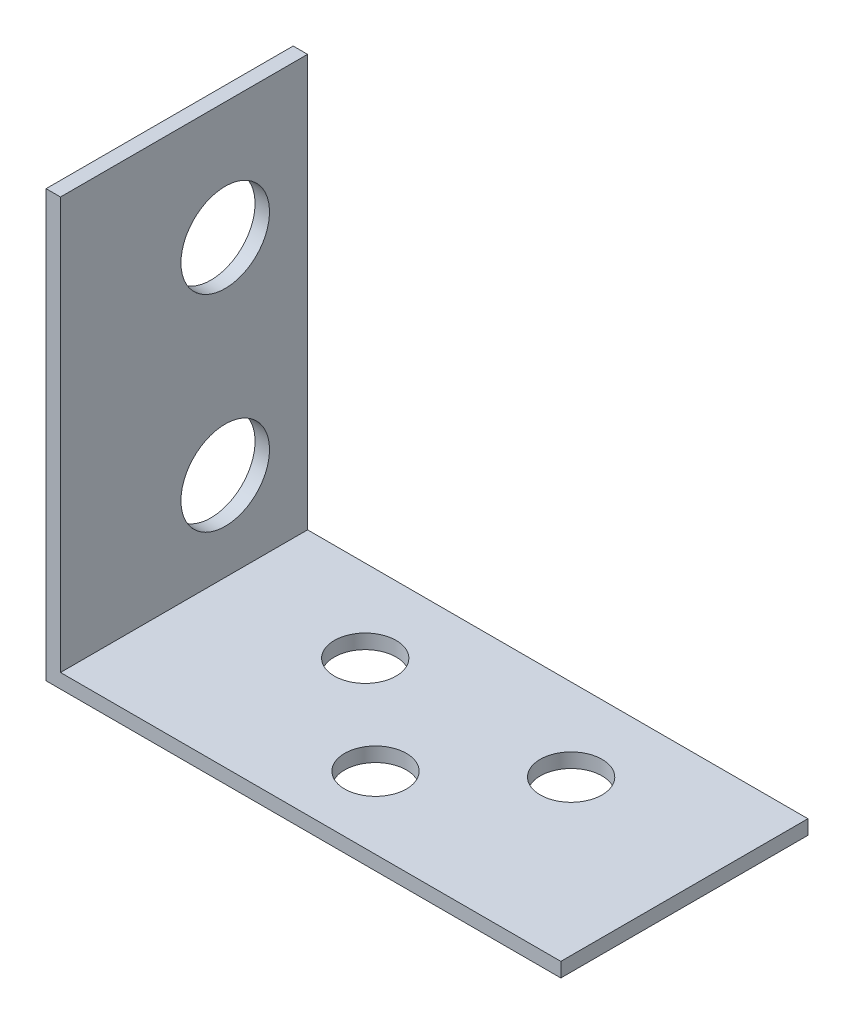
ISO-10303-21;
HEADER;
FILE_DESCRIPTION(('STEP AP214'),'2;1');
FILE_NAME('part.step','',(''),(''),'','','');
FILE_SCHEMA(('AUTOMOTIVE_DESIGN { 1 0 10303 214 1 1 1 1 }'));
ENDSEC;
DATA;
#1=APPLICATION_CONTEXT('core data for automotive mechanical design processes');
#2=APPLICATION_PROTOCOL_DEFINITION('international standard','automotive_design',2000,#1);
#3=PRODUCT_CONTEXT('',#1,'mechanical');
#4=PRODUCT('Part','Part','',(#3));
#5=PRODUCT_RELATED_PRODUCT_CATEGORY('part','',(#4));
#6=PRODUCT_DEFINITION_FORMATION('','',#4);
#7=PRODUCT_DEFINITION_CONTEXT('part definition',#1,'design');
#8=PRODUCT_DEFINITION('design','',#6,#7);
#9=PRODUCT_DEFINITION_SHAPE('','',#8);
#10=(LENGTH_UNIT() NAMED_UNIT(*) SI_UNIT(.MILLI.,.METRE.));
#11=(NAMED_UNIT(*) PLANE_ANGLE_UNIT() SI_UNIT($,.RADIAN.));
#12=(NAMED_UNIT(*) SI_UNIT($,.STERADIAN.) SOLID_ANGLE_UNIT());
#13=UNCERTAINTY_MEASURE_WITH_UNIT(LENGTH_MEASURE(1.E-05),#10,'distance_accuracy_value','');
#14=(GEOMETRIC_REPRESENTATION_CONTEXT(3) GLOBAL_UNCERTAINTY_ASSIGNED_CONTEXT((#13)) GLOBAL_UNIT_ASSIGNED_CONTEXT((#10,
#11,#12)) REPRESENTATION_CONTEXT('',''));
#15=CARTESIAN_POINT('',(0.,0.,0.));
#16=DIRECTION('',(0.,0.,1.));
#17=DIRECTION('',(1.,0.,0.));
#18=AXIS2_PLACEMENT_3D('',#15,#16,#17);
#19=CARTESIAN_POINT('',(12.5,0.7,0.));
#20=DIRECTION('',(1.,0.,0.));
#21=DIRECTION('',(0.,0.,-1.));
#22=AXIS2_PLACEMENT_3D('',#19,#20,#21);
#23=PLANE('',#22);
#24=DIRECTION('',(0.,0.,1.));
#25=VECTOR('',#24,1.);
#26=CARTESIAN_POINT('',(12.5,0.,0.));
#27=LINE('',#26,#25);
#28=CARTESIAN_POINT('',(12.5,0.,-12.));
#29=VERTEX_POINT('',#28);
#30=CARTESIAN_POINT('',(12.5,0.,0.));
#31=VERTEX_POINT('',#30);
#32=EDGE_CURVE('E87',#29,#31,#27,.T.);
#33=ORIENTED_EDGE('',*,*,#32,.F.);
#34=DIRECTION('',(0.,-1.,0.));
#35=VECTOR('',#34,1.);
#36=CARTESIAN_POINT('',(12.5,0.7,-12.));
#37=LINE('',#36,#35);
#38=CARTESIAN_POINT('',(12.5,0.7,-12.));
#39=VERTEX_POINT('',#38);
#40=EDGE_CURVE('E11',#39,#29,#37,.T.);
#41=ORIENTED_EDGE('',*,*,#40,.F.);
#42=DIRECTION('',(0.,0.,1.));
#43=VECTOR('',#42,1.);
#44=CARTESIAN_POINT('',(12.5,0.7,0.));
#45=LINE('',#44,#43);
#46=CARTESIAN_POINT('',(12.5,0.7,0.));
#47=VERTEX_POINT('',#46);
#48=EDGE_CURVE('E89',#39,#47,#45,.T.);
#49=ORIENTED_EDGE('',*,*,#48,.T.);
#50=DIRECTION('',(0.,-1.,0.));
#51=VECTOR('',#50,1.);
#52=CARTESIAN_POINT('',(12.5,0.7,0.));
#53=LINE('',#52,#51);
#54=EDGE_CURVE('E83',#47,#31,#53,.T.);
#55=ORIENTED_EDGE('',*,*,#54,.T.);
#56=EDGE_LOOP('',(#33,#41,#49,#55));
#57=FACE_BOUND('',#56,.T.);
#58=ADVANCED_FACE('F41',(#57),#23,.T.);
#59=CARTESIAN_POINT('',(0.,0.7,-12.));
#60=DIRECTION('',(0.,0.,-1.));
#61=DIRECTION('',(-1.,0.,0.));
#62=AXIS2_PLACEMENT_3D('',#59,#60,#61);
#63=PLANE('',#62);
#64=DIRECTION('',(1.,0.,0.));
#65=VECTOR('',#64,1.);
#66=CARTESIAN_POINT('',(0.,0.,-12.));
#67=LINE('',#66,#65);
#68=CARTESIAN_POINT('',(-12.5,0.,-12.));
#69=VERTEX_POINT('',#68);
#70=EDGE_CURVE('E110',#69,#29,#67,.T.);
#71=ORIENTED_EDGE('',*,*,#70,.F.);
#72=DIRECTION('',(0.,-1.,0.));
#73=VECTOR('',#72,1.);
#74=CARTESIAN_POINT('',(-12.5,0.7,-12.));
#75=LINE('',#74,#73);
#76=CARTESIAN_POINT('',(-12.5,20.7,-12.));
#77=VERTEX_POINT('',#76);
#78=EDGE_CURVE('E51',#77,#69,#75,.T.);
#79=ORIENTED_EDGE('',*,*,#78,.F.);
#80=DIRECTION('',(-1.,0.,0.));
#81=VECTOR('',#80,1.);
#82=CARTESIAN_POINT('',(-12.5,20.7,-12.));
#83=LINE('',#82,#81);
#84=CARTESIAN_POINT('',(-11.8,20.7,-12.));
#85=VERTEX_POINT('',#84);
#86=EDGE_CURVE('E165',#85,#77,#83,.T.);
#87=ORIENTED_EDGE('',*,*,#86,.F.);
#88=DIRECTION('',(0.,-1.,0.));
#89=VECTOR('',#88,1.);
#90=CARTESIAN_POINT('',(-11.8,20.7,-12.));
#91=LINE('',#90,#89);
#92=CARTESIAN_POINT('',(-11.8,0.7,-12.));
#93=VERTEX_POINT('',#92);
#94=EDGE_CURVE('E169',#85,#93,#91,.T.);
#95=ORIENTED_EDGE('',*,*,#94,.T.);
#96=DIRECTION('',(1.,0.,0.));
#97=VECTOR('',#96,1.);
#98=CARTESIAN_POINT('',(0.,0.7,-12.));
#99=LINE('',#98,#97);
#100=EDGE_CURVE('E183',#93,#39,#99,.T.);
#101=ORIENTED_EDGE('',*,*,#100,.T.);
#102=ORIENTED_EDGE('',*,*,#40,.T.);
#103=EDGE_LOOP('',(#71,#79,#87,#95,#101,#102));
#104=FACE_BOUND('',#103,.T.);
#105=ADVANCED_FACE('F216',(#104),#63,.T.);
#106=CARTESIAN_POINT('',(-12.5,0.7,0.));
#107=DIRECTION('',(1.,0.,0.));
#108=DIRECTION('',(0.,0.,-1.));
#109=AXIS2_PLACEMENT_3D('',#106,#107,#108);
#110=PLANE('',#109);
#111=CARTESIAN_POINT('',(-12.5,5.,-8.));
#112=DIRECTION('',(-1.,0.,0.));
#113=DIRECTION('',(0.,0.,1.));
#114=AXIS2_PLACEMENT_3D('',#111,#112,#113);
#115=CIRCLE('',#114,2.15);
#116=CARTESIAN_POINT('',(-12.5,5.,-5.85));
#117=VERTEX_POINT('',#116);
#118=EDGE_CURVE('E138',#117,#117,#115,.T.);
#119=ORIENTED_EDGE('',*,*,#118,.F.);
#120=EDGE_LOOP('',(#119));
#121=FACE_BOUND('',#120,.T.);
#122=CARTESIAN_POINT('',(-12.5,15.,-8.));
#123=DIRECTION('',(-1.,0.,0.));
#124=DIRECTION('',(0.,0.,1.));
#125=AXIS2_PLACEMENT_3D('',#122,#123,#124);
#126=CIRCLE('',#125,2.15);
#127=CARTESIAN_POINT('',(-12.5,15.,-5.85));
#128=VERTEX_POINT('',#127);
#129=EDGE_CURVE('E145',#128,#128,#126,.T.);
#130=ORIENTED_EDGE('',*,*,#129,.F.);
#131=EDGE_LOOP('',(#130));
#132=FACE_BOUND('',#131,.T.);
#133=DIRECTION('',(0.,0.,1.));
#134=VECTOR('',#133,1.);
#135=CARTESIAN_POINT('',(-12.5,0.,0.));
#136=LINE('',#135,#134);
#137=CARTESIAN_POINT('',(-12.5,0.,0.));
#138=VERTEX_POINT('',#137);
#139=EDGE_CURVE('E105',#69,#138,#136,.T.);
#140=ORIENTED_EDGE('',*,*,#139,.T.);
#141=DIRECTION('',(0.,-1.,0.));
#142=VECTOR('',#141,1.);
#143=CARTESIAN_POINT('',(-12.5,0.7,0.));
#144=LINE('',#143,#142);
#145=CARTESIAN_POINT('',(-12.5,20.7,0.));
#146=VERTEX_POINT('',#145);
#147=EDGE_CURVE('E92',#146,#138,#144,.T.);
#148=ORIENTED_EDGE('',*,*,#147,.F.);
#149=DIRECTION('',(0.,0.,1.));
#150=VECTOR('',#149,1.);
#151=CARTESIAN_POINT('',(-12.5,20.7,0.));
#152=LINE('',#151,#150);
#153=EDGE_CURVE('E153',#77,#146,#152,.T.);
#154=ORIENTED_EDGE('',*,*,#153,.F.);
#155=ORIENTED_EDGE('',*,*,#78,.T.);
#156=EDGE_LOOP('',(#140,#148,#154,#155));
#157=FACE_BOUND('',#156,.T.);
#158=ADVANCED_FACE('F220',(#121,#132,#157),#110,.F.);
#159=CARTESIAN_POINT('',(-5.00000000000001,0.7,-8.));
#160=DIRECTION('',(0.,-1.,0.));
#161=DIRECTION('',(0.,0.,-1.));
#162=AXIS2_PLACEMENT_3D('',#159,#160,#161);
#163=CYLINDRICAL_SURFACE('',#162,1.5);
#164=CARTESIAN_POINT('',(-5.00000000000001,0.7,-8.));
#165=DIRECTION('',(0.,1.,0.));
#166=DIRECTION('',(0.,0.,1.));
#167=AXIS2_PLACEMENT_3D('',#164,#165,#166);
#168=CIRCLE('',#167,1.5);
#169=CARTESIAN_POINT('',(-5.00000000000001,0.7,-6.5));
#170=VERTEX_POINT('',#169);
#171=EDGE_CURVE('E188',#170,#170,#168,.T.);
#172=ORIENTED_EDGE('',*,*,#171,.T.);
#173=EDGE_LOOP('',(#172));
#174=FACE_BOUND('',#173,.T.);
#175=CARTESIAN_POINT('',(-5.00000000000001,0.,-8.));
#176=DIRECTION('',(0.,1.,0.));
#177=DIRECTION('',(0.,0.,1.));
#178=AXIS2_PLACEMENT_3D('',#175,#176,#177);
#179=CIRCLE('',#178,1.5);
#180=CARTESIAN_POINT('',(-5.00000000000001,0.,-6.5));
#181=VERTEX_POINT('',#180);
#182=EDGE_CURVE('E104',#181,#181,#179,.T.);
#183=ORIENTED_EDGE('',*,*,#182,.F.);
#184=EDGE_LOOP('',(#183));
#185=FACE_BOUND('',#184,.T.);
#186=ADVANCED_FACE('F226',(#174,#185),#163,.F.);
#187=CARTESIAN_POINT('',(0.,0.7,0.));
#188=DIRECTION('',(0.,0.,-1.));
#189=DIRECTION('',(-1.,0.,0.));
#190=AXIS2_PLACEMENT_3D('',#187,#188,#189);
#191=PLANE('',#190);
#192=DIRECTION('',(1.,0.,0.));
#193=VECTOR('',#192,1.);
#194=CARTESIAN_POINT('',(0.,0.,0.));
#195=LINE('',#194,#193);
#196=EDGE_CURVE('E96',#138,#31,#195,.T.);
#197=ORIENTED_EDGE('',*,*,#196,.T.);
#198=ORIENTED_EDGE('',*,*,#54,.F.);
#199=DIRECTION('',(1.,0.,0.));
#200=VECTOR('',#199,1.);
#201=CARTESIAN_POINT('',(0.,0.7,0.));
#202=LINE('',#201,#200);
#203=CARTESIAN_POINT('',(-11.8,0.7,0.));
#204=VERTEX_POINT('',#203);
#205=EDGE_CURVE('E64',#204,#47,#202,.T.);
#206=ORIENTED_EDGE('',*,*,#205,.F.);
#207=DIRECTION('',(0.,-1.,0.));
#208=VECTOR('',#207,1.);
#209=CARTESIAN_POINT('',(-11.8,20.7,0.));
#210=LINE('',#209,#208);
#211=CARTESIAN_POINT('',(-11.8,20.7,0.));
#212=VERTEX_POINT('',#211);
#213=EDGE_CURVE('E118',#212,#204,#210,.T.);
#214=ORIENTED_EDGE('',*,*,#213,.F.);
#215=DIRECTION('',(1.,0.,0.));
#216=VECTOR('',#215,1.);
#217=CARTESIAN_POINT('',(-12.5,20.7,0.));
#218=LINE('',#217,#216);
#219=EDGE_CURVE('E157',#146,#212,#218,.T.);
#220=ORIENTED_EDGE('',*,*,#219,.F.);
#221=ORIENTED_EDGE('',*,*,#147,.T.);
#222=EDGE_LOOP('',(#197,#198,#206,#214,#220,#221));
#223=FACE_BOUND('',#222,.T.);
#224=ADVANCED_FACE('F97',(#223),#191,.F.);
#225=CARTESIAN_POINT('',(0.,0.7,-3.5));
#226=DIRECTION('',(0.,-1.,0.));
#227=DIRECTION('',(0.,0.,-1.));
#228=AXIS2_PLACEMENT_3D('',#225,#226,#227);
#229=CYLINDRICAL_SURFACE('',#228,1.5);
#230=CARTESIAN_POINT('',(0.,0.7,-3.5));
#231=DIRECTION('',(0.,1.,0.));
#232=DIRECTION('',(0.,0.,1.));
#233=AXIS2_PLACEMENT_3D('',#230,#231,#232);
#234=CIRCLE('',#233,1.5);
#235=CARTESIAN_POINT('',(0.,0.7,-2.));
#236=VERTEX_POINT('',#235);
#237=EDGE_CURVE('E130',#236,#236,#234,.T.);
#238=ORIENTED_EDGE('',*,*,#237,.T.);
#239=EDGE_LOOP('',(#238));
#240=FACE_BOUND('',#239,.T.);
#241=CARTESIAN_POINT('',(0.,0.,-3.5));
#242=DIRECTION('',(0.,1.,0.));
#243=DIRECTION('',(0.,0.,1.));
#244=AXIS2_PLACEMENT_3D('',#241,#242,#243);
#245=CIRCLE('',#244,1.5);
#246=CARTESIAN_POINT('',(0.,0.,-2.));
#247=VERTEX_POINT('',#246);
#248=EDGE_CURVE('E112',#247,#247,#245,.T.);
#249=ORIENTED_EDGE('',*,*,#248,.F.);
#250=EDGE_LOOP('',(#249));
#251=FACE_BOUND('',#250,.T.);
#252=ADVANCED_FACE('F43',(#240,#251),#229,.F.);
#253=CARTESIAN_POINT('',(5.00000000000001,0.7,-8.));
#254=DIRECTION('',(0.,-1.,0.));
#255=DIRECTION('',(0.,0.,-1.));
#256=AXIS2_PLACEMENT_3D('',#253,#254,#255);
#257=CYLINDRICAL_SURFACE('',#256,1.5);
#258=CARTESIAN_POINT('',(5.00000000000001,0.7,-8.));
#259=DIRECTION('',(0.,1.,0.));
#260=DIRECTION('',(0.,0.,1.));
#261=AXIS2_PLACEMENT_3D('',#258,#259,#260);
#262=CIRCLE('',#261,1.5);
#263=CARTESIAN_POINT('',(5.00000000000001,0.7,-6.5));
#264=VERTEX_POINT('',#263);
#265=EDGE_CURVE('E93',#264,#264,#262,.F.);
#266=ORIENTED_EDGE('',*,*,#265,.F.);
#267=EDGE_LOOP('',(#266));
#268=FACE_BOUND('',#267,.T.);
#269=CARTESIAN_POINT('',(5.00000000000001,0.,-8.));
#270=DIRECTION('',(0.,1.,0.));
#271=DIRECTION('',(0.,0.,1.));
#272=AXIS2_PLACEMENT_3D('',#269,#270,#271);
#273=CIRCLE('',#272,1.5);
#274=CARTESIAN_POINT('',(5.00000000000001,0.,-6.5));
#275=VERTEX_POINT('',#274);
#276=EDGE_CURVE('E127',#275,#275,#273,.F.);
#277=ORIENTED_EDGE('',*,*,#276,.T.);
#278=EDGE_LOOP('',(#277));
#279=FACE_BOUND('',#278,.T.);
#280=ADVANCED_FACE('F197',(#268,#279),#257,.F.);
#281=CARTESIAN_POINT('',(0.,0.7,0.));
#282=DIRECTION('',(0.,1.,0.));
#283=DIRECTION('',(0.,0.,1.));
#284=AXIS2_PLACEMENT_3D('',#281,#282,#283);
#285=PLANE('',#284);
#286=DIRECTION('',(0.,0.,-1.));
#287=VECTOR('',#286,1.);
#288=CARTESIAN_POINT('',(-11.8,0.7,0.));
#289=LINE('',#288,#287);
#290=EDGE_CURVE('E59',#204,#93,#289,.T.);
#291=ORIENTED_EDGE('',*,*,#290,.F.);
#292=ORIENTED_EDGE('',*,*,#205,.T.);
#293=ORIENTED_EDGE('',*,*,#48,.F.);
#294=ORIENTED_EDGE('',*,*,#100,.F.);
#295=EDGE_LOOP('',(#291,#292,#293,#294));
#296=FACE_BOUND('',#295,.T.);
#297=ORIENTED_EDGE('',*,*,#237,.F.);
#298=EDGE_LOOP('',(#297));
#299=FACE_BOUND('',#298,.T.);
#300=ORIENTED_EDGE('',*,*,#171,.F.);
#301=EDGE_LOOP('',(#300));
#302=FACE_BOUND('',#301,.T.);
#303=ORIENTED_EDGE('',*,*,#265,.T.);
#304=EDGE_LOOP('',(#303));
#305=FACE_BOUND('',#304,.T.);
#306=ADVANCED_FACE('F195',(#296,#299,#302,#305),#285,.T.);
#307=CARTESIAN_POINT('',(0.,0.,0.));
#308=DIRECTION('',(0.,1.,0.));
#309=DIRECTION('',(0.,0.,1.));
#310=AXIS2_PLACEMENT_3D('',#307,#308,#309);
#311=PLANE('',#310);
#312=ORIENTED_EDGE('',*,*,#248,.T.);
#313=EDGE_LOOP('',(#312));
#314=FACE_BOUND('',#313,.T.);
#315=ORIENTED_EDGE('',*,*,#32,.T.);
#316=ORIENTED_EDGE('',*,*,#196,.F.);
#317=ORIENTED_EDGE('',*,*,#139,.F.);
#318=ORIENTED_EDGE('',*,*,#70,.T.);
#319=EDGE_LOOP('',(#315,#316,#317,#318));
#320=FACE_BOUND('',#319,.T.);
#321=ORIENTED_EDGE('',*,*,#182,.T.);
#322=EDGE_LOOP('',(#321));
#323=FACE_BOUND('',#322,.T.);
#324=ORIENTED_EDGE('',*,*,#276,.F.);
#325=EDGE_LOOP('',(#324));
#326=FACE_BOUND('',#325,.T.);
#327=ADVANCED_FACE('F107',(#314,#320,#323,#326),#311,.F.);
#328=CARTESIAN_POINT('',(-11.8,20.7,0.));
#329=DIRECTION('',(-1.,0.,0.));
#330=DIRECTION('',(0.,0.,1.));
#331=AXIS2_PLACEMENT_3D('',#328,#329,#330);
#332=PLANE('',#331);
#333=CARTESIAN_POINT('',(-11.8,5.,-8.));
#334=DIRECTION('',(-1.,0.,0.));
#335=DIRECTION('',(0.,0.,1.));
#336=AXIS2_PLACEMENT_3D('',#333,#334,#335);
#337=CIRCLE('',#336,2.15);
#338=CARTESIAN_POINT('',(-11.8,5.,-5.85));
#339=VERTEX_POINT('',#338);
#340=EDGE_CURVE('E45',#339,#339,#337,.T.);
#341=ORIENTED_EDGE('',*,*,#340,.T.);
#342=EDGE_LOOP('',(#341));
#343=FACE_BOUND('',#342,.T.);
#344=CARTESIAN_POINT('',(-11.8,15.,-8.));
#345=DIRECTION('',(-1.,0.,0.));
#346=DIRECTION('',(0.,0.,1.));
#347=AXIS2_PLACEMENT_3D('',#344,#345,#346);
#348=CIRCLE('',#347,2.15);
#349=CARTESIAN_POINT('',(-11.8,15.,-5.85));
#350=VERTEX_POINT('',#349);
#351=EDGE_CURVE('E135',#350,#350,#348,.T.);
#352=ORIENTED_EDGE('',*,*,#351,.T.);
#353=EDGE_LOOP('',(#352));
#354=FACE_BOUND('',#353,.T.);
#355=ORIENTED_EDGE('',*,*,#290,.T.);
#356=ORIENTED_EDGE('',*,*,#94,.F.);
#357=DIRECTION('',(0.,0.,-1.));
#358=VECTOR('',#357,1.);
#359=CARTESIAN_POINT('',(-11.8,20.7,0.));
#360=LINE('',#359,#358);
#361=EDGE_CURVE('E161',#212,#85,#360,.T.);
#362=ORIENTED_EDGE('',*,*,#361,.F.);
#363=ORIENTED_EDGE('',*,*,#213,.T.);
#364=EDGE_LOOP('',(#355,#356,#362,#363));
#365=FACE_BOUND('',#364,.T.);
#366=ADVANCED_FACE('F204',(#343,#354,#365),#332,.F.);
#367=CARTESIAN_POINT('',(0.,20.7,0.));
#368=DIRECTION('',(0.,-1.,0.));
#369=DIRECTION('',(0.,0.,-1.));
#370=AXIS2_PLACEMENT_3D('',#367,#368,#369);
#371=PLANE('',#370);
#372=ORIENTED_EDGE('',*,*,#153,.T.);
#373=ORIENTED_EDGE('',*,*,#219,.T.);
#374=ORIENTED_EDGE('',*,*,#361,.T.);
#375=ORIENTED_EDGE('',*,*,#86,.T.);
#376=EDGE_LOOP('',(#372,#373,#374,#375));
#377=FACE_BOUND('',#376,.T.);
#378=ADVANCED_FACE('F211',(#377),#371,.F.);
#379=CARTESIAN_POINT('',(12.5,15.,-8.00000000000001));
#380=DIRECTION('',(-1.,0.,0.));
#381=DIRECTION('',(0.,0.,1.));
#382=AXIS2_PLACEMENT_3D('',#379,#380,#381);
#383=CYLINDRICAL_SURFACE('',#382,2.15);
#384=ORIENTED_EDGE('',*,*,#129,.T.);
#385=EDGE_LOOP('',(#384));
#386=FACE_BOUND('',#385,.T.);
#387=ORIENTED_EDGE('',*,*,#351,.F.);
#388=EDGE_LOOP('',(#387));
#389=FACE_BOUND('',#388,.T.);
#390=ADVANCED_FACE('F269',(#386,#389),#383,.F.);
#391=CARTESIAN_POINT('',(12.5,5.,-8.00000000000001));
#392=DIRECTION('',(-1.,0.,0.));
#393=DIRECTION('',(0.,0.,1.));
#394=AXIS2_PLACEMENT_3D('',#391,#392,#393);
#395=CYLINDRICAL_SURFACE('',#394,2.15);
#396=ORIENTED_EDGE('',*,*,#118,.T.);
#397=EDGE_LOOP('',(#396));
#398=FACE_BOUND('',#397,.T.);
#399=ORIENTED_EDGE('',*,*,#340,.F.);
#400=EDGE_LOOP('',(#399));
#401=FACE_BOUND('',#400,.T.);
#402=ADVANCED_FACE('F292',(#398,#401),#395,.F.);
#403=CLOSED_SHELL('',(#58,#105,#158,#186,#224,#252,#280,#306,#327,#366,#378,#390,#402));
#404=MANIFOLD_SOLID_BREP('B2',#403);
#405=ADVANCED_BREP_SHAPE_REPRESENTATION('',(#18,#404),#14);
#406=SHAPE_DEFINITION_REPRESENTATION(#9,#405);
ENDSEC;
END-ISO-10303-21;
